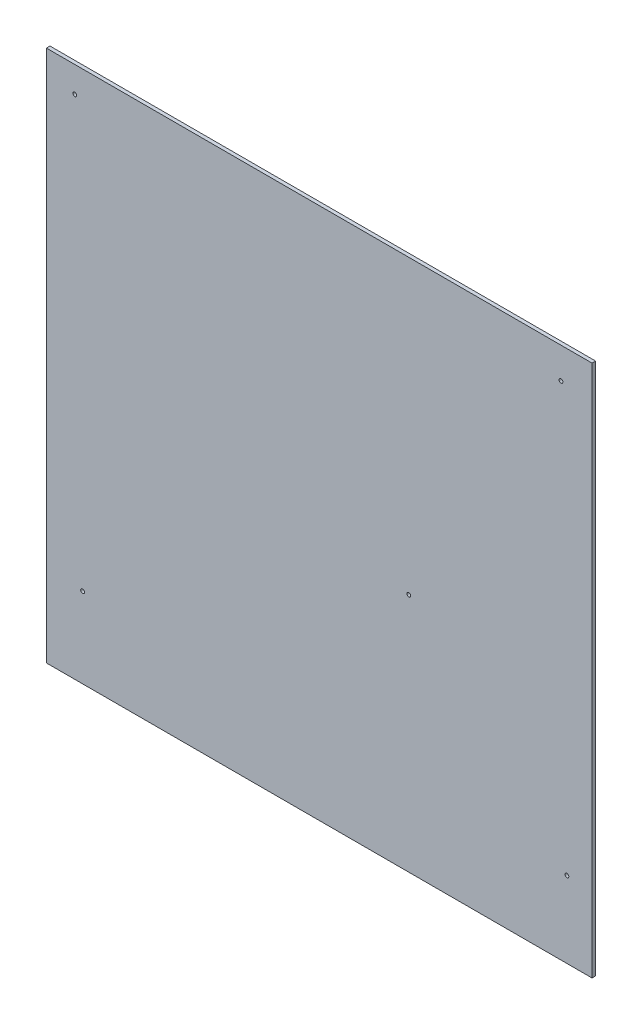
ISO-10303-21;
HEADER;
FILE_DESCRIPTION(('STEP AP214'),'2;1');
FILE_NAME('part.step','',(''),(''),'','','');
FILE_SCHEMA(('AUTOMOTIVE_DESIGN { 1 0 10303 214 1 1 1 1 }'));
ENDSEC;
DATA;
#1=APPLICATION_CONTEXT('core data for automotive mechanical design processes');
#2=APPLICATION_PROTOCOL_DEFINITION('international standard','automotive_design',2000,#1);
#3=PRODUCT_CONTEXT('',#1,'mechanical');
#4=PRODUCT('Part','Part','',(#3));
#5=PRODUCT_RELATED_PRODUCT_CATEGORY('part','',(#4));
#6=PRODUCT_DEFINITION_FORMATION('','',#4);
#7=PRODUCT_DEFINITION_CONTEXT('part definition',#1,'design');
#8=PRODUCT_DEFINITION('design','',#6,#7);
#9=PRODUCT_DEFINITION_SHAPE('','',#8);
#10=(LENGTH_UNIT() NAMED_UNIT(*) SI_UNIT(.MILLI.,.METRE.));
#11=(NAMED_UNIT(*) PLANE_ANGLE_UNIT() SI_UNIT($,.RADIAN.));
#12=(NAMED_UNIT(*) SI_UNIT($,.STERADIAN.) SOLID_ANGLE_UNIT());
#13=UNCERTAINTY_MEASURE_WITH_UNIT(LENGTH_MEASURE(1.E-05),#10,'distance_accuracy_value','');
#14=(GEOMETRIC_REPRESENTATION_CONTEXT(3) GLOBAL_UNCERTAINTY_ASSIGNED_CONTEXT((#13)) GLOBAL_UNIT_ASSIGNED_CONTEXT((#10,
#11,#12)) REPRESENTATION_CONTEXT('',''));
#15=CARTESIAN_POINT('',(0.,0.,0.));
#16=DIRECTION('',(0.,0.,1.));
#17=DIRECTION('',(1.,0.,0.));
#18=AXIS2_PLACEMENT_3D('',#15,#16,#17);
#19=CARTESIAN_POINT('',(0.,0.,3.));
#20=DIRECTION('',(0.,0.,1.));
#21=DIRECTION('',(1.,0.,0.));
#22=AXIS2_PLACEMENT_3D('',#19,#20,#21);
#23=PLANE('',#22);
#24=CARTESIAN_POINT('',(-440.703759338458,458.22247677224,3.));
#25=DIRECTION('',(0.,0.,1.));
#26=DIRECTION('',(1.,0.,0.));
#27=AXIS2_PLACEMENT_3D('',#24,#25,#26);
#28=CIRCLE('',#27,1.60000000000002);
#29=CARTESIAN_POINT('',(-439.103759338458,458.22247677224,3.));
#30=VERTEX_POINT('',#29);
#31=EDGE_CURVE('E126',#30,#30,#28,.T.);
#32=ORIENTED_EDGE('',*,*,#31,.F.);
#33=EDGE_LOOP('',(#32));
#34=FACE_BOUND('',#33,.T.);
#35=CARTESIAN_POINT('',(-27.6676299378187,96.9264277505402,3.));
#36=DIRECTION('',(0.,0.,1.));
#37=DIRECTION('',(1.,0.,0.));
#38=AXIS2_PLACEMENT_3D('',#35,#36,#37);
#39=CIRCLE('',#38,1.60000000000002);
#40=CARTESIAN_POINT('',(-26.0676299378187,96.9264277505402,3.));
#41=VERTEX_POINT('',#40);
#42=EDGE_CURVE('E114',#41,#41,#39,.T.);
#43=ORIENTED_EDGE('',*,*,#42,.F.);
#44=EDGE_LOOP('',(#43));
#45=FACE_BOUND('',#44,.T.);
#46=DIRECTION('',(0.,-1.,0.));
#47=VECTOR('',#46,1.);
#48=CARTESIAN_POINT('',(-464.552631863683,479.970647341209,3.));
#49=LINE('',#48,#47);
#50=CARTESIAN_POINT('',(-464.552631863683,479.970647341209,3.));
#51=VERTEX_POINT('',#50);
#52=CARTESIAN_POINT('',(-464.552631863683,32.9706473402095,3.));
#53=VERTEX_POINT('',#52);
#54=EDGE_CURVE('E84',#51,#53,#49,.T.);
#55=ORIENTED_EDGE('',*,*,#54,.T.);
#56=DIRECTION('',(1.,0.,0.));
#57=VECTOR('',#56,1.);
#58=CARTESIAN_POINT('',(-464.552631863683,32.9706473402095,3.));
#59=LINE('',#58,#57);
#60=CARTESIAN_POINT('',(-6.55263186291066,32.9706473402095,3.));
#61=VERTEX_POINT('',#60);
#62=EDGE_CURVE('E79',#53,#61,#59,.T.);
#63=ORIENTED_EDGE('',*,*,#62,.T.);
#64=DIRECTION('',(0.,1.,0.));
#65=VECTOR('',#64,1.);
#66=CARTESIAN_POINT('',(-6.55263186291066,479.970647341209,3.));
#67=LINE('',#66,#65);
#68=CARTESIAN_POINT('',(-6.55263186291066,479.970647341209,3.));
#69=VERTEX_POINT('',#68);
#70=EDGE_CURVE('E82',#61,#69,#67,.T.);
#71=ORIENTED_EDGE('',*,*,#70,.T.);
#72=DIRECTION('',(-1.,0.,0.));
#73=VECTOR('',#72,1.);
#74=CARTESIAN_POINT('',(-464.552631863683,479.970647341209,3.));
#75=LINE('',#74,#73);
#76=EDGE_CURVE('E49',#69,#51,#75,.T.);
#77=ORIENTED_EDGE('',*,*,#76,.T.);
#78=EDGE_LOOP('',(#55,#63,#71,#77));
#79=FACE_BOUND('',#78,.T.);
#80=CARTESIAN_POINT('',(-434.145413024924,100.3546542326,3.));
#81=DIRECTION('',(0.,0.,1.));
#82=DIRECTION('',(1.,0.,0.));
#83=AXIS2_PLACEMENT_3D('',#80,#81,#82);
#84=CIRCLE('',#83,1.60000000000002);
#85=CARTESIAN_POINT('',(-432.545413024924,100.3546542326,3.));
#86=VERTEX_POINT('',#85);
#87=EDGE_CURVE('E99',#86,#86,#84,.T.);
#88=ORIENTED_EDGE('',*,*,#87,.F.);
#89=EDGE_LOOP('',(#88));
#90=FACE_BOUND('',#89,.T.);
#91=CARTESIAN_POINT('',(-32.6407755290077,453.971767774607,3.));
#92=DIRECTION('',(0.,0.,1.));
#93=DIRECTION('',(1.,0.,0.));
#94=AXIS2_PLACEMENT_3D('',#91,#92,#93);
#95=CIRCLE('',#94,1.60000000000002);
#96=CARTESIAN_POINT('',(-31.0407755290077,453.971767774607,3.));
#97=VERTEX_POINT('',#96);
#98=EDGE_CURVE('E120',#97,#97,#95,.T.);
#99=ORIENTED_EDGE('',*,*,#98,.F.);
#100=EDGE_LOOP('',(#99));
#101=FACE_BOUND('',#100,.T.);
#102=CARTESIAN_POINT('',(-160.352631862911,234.620647340209,3.));
#103=DIRECTION('',(0.,0.,1.));
#104=DIRECTION('',(1.,0.,0.));
#105=AXIS2_PLACEMENT_3D('',#102,#103,#104);
#106=CIRCLE('',#105,1.59999999999997);
#107=CARTESIAN_POINT('',(-158.752631862911,234.620647340209,3.));
#108=VERTEX_POINT('',#107);
#109=EDGE_CURVE('E132',#108,#108,#106,.T.);
#110=ORIENTED_EDGE('',*,*,#109,.F.);
#111=EDGE_LOOP('',(#110));
#112=FACE_BOUND('',#111,.T.);
#113=ADVANCED_FACE('F32',(#34,#45,#79,#90,#101,#112),#23,.T.);
#114=CARTESIAN_POINT('',(0.,0.,0.));
#115=DIRECTION('',(0.,0.,1.));
#116=DIRECTION('',(1.,0.,0.));
#117=AXIS2_PLACEMENT_3D('',#114,#115,#116);
#118=PLANE('',#117);
#119=DIRECTION('',(0.,-1.,0.));
#120=VECTOR('',#119,1.);
#121=CARTESIAN_POINT('',(-464.552631863683,479.970647341209,0.));
#122=LINE('',#121,#120);
#123=CARTESIAN_POINT('',(-464.552631863683,479.970647341209,0.));
#124=VERTEX_POINT('',#123);
#125=CARTESIAN_POINT('',(-464.552631863683,32.9706473402095,0.));
#126=VERTEX_POINT('',#125);
#127=EDGE_CURVE('E96',#124,#126,#122,.T.);
#128=ORIENTED_EDGE('',*,*,#127,.F.);
#129=DIRECTION('',(-1.,0.,0.));
#130=VECTOR('',#129,1.);
#131=CARTESIAN_POINT('',(-464.552631863683,479.970647341209,0.));
#132=LINE('',#131,#130);
#133=CARTESIAN_POINT('',(-6.55263186291066,479.970647341209,0.));
#134=VERTEX_POINT('',#133);
#135=EDGE_CURVE('E72',#134,#124,#132,.T.);
#136=ORIENTED_EDGE('',*,*,#135,.F.);
#137=DIRECTION('',(0.,1.,0.));
#138=VECTOR('',#137,1.);
#139=CARTESIAN_POINT('',(-6.55263186291066,479.970647341209,0.));
#140=LINE('',#139,#138);
#141=CARTESIAN_POINT('',(-6.55263186291066,32.9706473402095,0.));
#142=VERTEX_POINT('',#141);
#143=EDGE_CURVE('E66',#142,#134,#140,.T.);
#144=ORIENTED_EDGE('',*,*,#143,.F.);
#145=DIRECTION('',(1.,0.,0.));
#146=VECTOR('',#145,1.);
#147=CARTESIAN_POINT('',(-464.552631863683,32.9706473402095,0.));
#148=LINE('',#147,#146);
#149=EDGE_CURVE('E88',#126,#142,#148,.T.);
#150=ORIENTED_EDGE('',*,*,#149,.F.);
#151=EDGE_LOOP('',(#128,#136,#144,#150));
#152=FACE_BOUND('',#151,.T.);
#153=CARTESIAN_POINT('',(-434.145413024924,100.3546542326,0.));
#154=DIRECTION('',(0.,0.,1.));
#155=DIRECTION('',(1.,0.,0.));
#156=AXIS2_PLACEMENT_3D('',#153,#154,#155);
#157=CIRCLE('',#156,1.60000000000002);
#158=CARTESIAN_POINT('',(-432.545413024924,100.3546542326,0.));
#159=VERTEX_POINT('',#158);
#160=EDGE_CURVE('E111',#159,#159,#157,.T.);
#161=ORIENTED_EDGE('',*,*,#160,.T.);
#162=EDGE_LOOP('',(#161));
#163=FACE_BOUND('',#162,.T.);
#164=CARTESIAN_POINT('',(-27.6676299378187,96.9264277505402,0.));
#165=DIRECTION('',(0.,0.,1.));
#166=DIRECTION('',(1.,0.,0.));
#167=AXIS2_PLACEMENT_3D('',#164,#165,#166);
#168=CIRCLE('',#167,1.60000000000002);
#169=CARTESIAN_POINT('',(-26.0676299378187,96.9264277505402,0.));
#170=VERTEX_POINT('',#169);
#171=EDGE_CURVE('E117',#170,#170,#168,.T.);
#172=ORIENTED_EDGE('',*,*,#171,.T.);
#173=EDGE_LOOP('',(#172));
#174=FACE_BOUND('',#173,.T.);
#175=CARTESIAN_POINT('',(-32.6407755290077,453.971767774607,0.));
#176=DIRECTION('',(0.,0.,1.));
#177=DIRECTION('',(1.,0.,0.));
#178=AXIS2_PLACEMENT_3D('',#175,#176,#177);
#179=CIRCLE('',#178,1.60000000000002);
#180=CARTESIAN_POINT('',(-31.0407755290077,453.971767774607,0.));
#181=VERTEX_POINT('',#180);
#182=EDGE_CURVE('E123',#181,#181,#179,.T.);
#183=ORIENTED_EDGE('',*,*,#182,.T.);
#184=EDGE_LOOP('',(#183));
#185=FACE_BOUND('',#184,.T.);
#186=CARTESIAN_POINT('',(-440.703759338458,458.22247677224,0.));
#187=DIRECTION('',(0.,0.,1.));
#188=DIRECTION('',(1.,0.,0.));
#189=AXIS2_PLACEMENT_3D('',#186,#187,#188);
#190=CIRCLE('',#189,1.60000000000002);
#191=CARTESIAN_POINT('',(-439.103759338458,458.22247677224,0.));
#192=VERTEX_POINT('',#191);
#193=EDGE_CURVE('E129',#192,#192,#190,.T.);
#194=ORIENTED_EDGE('',*,*,#193,.T.);
#195=EDGE_LOOP('',(#194));
#196=FACE_BOUND('',#195,.T.);
#197=CARTESIAN_POINT('',(-160.352631862911,234.620647340209,0.));
#198=DIRECTION('',(0.,0.,1.));
#199=DIRECTION('',(1.,0.,0.));
#200=AXIS2_PLACEMENT_3D('',#197,#198,#199);
#201=CIRCLE('',#200,1.59999999999997);
#202=CARTESIAN_POINT('',(-158.752631862911,234.620647340209,0.));
#203=VERTEX_POINT('',#202);
#204=EDGE_CURVE('E135',#203,#203,#201,.T.);
#205=ORIENTED_EDGE('',*,*,#204,.T.);
#206=EDGE_LOOP('',(#205));
#207=FACE_BOUND('',#206,.T.);
#208=ADVANCED_FACE('F107',(#152,#163,#174,#185,#196,#207),#118,.F.);
#209=CARTESIAN_POINT('',(-464.552631863683,479.970647341209,3.));
#210=DIRECTION('',(1.,0.,0.));
#211=DIRECTION('',(0.,0.,-1.));
#212=AXIS2_PLACEMENT_3D('',#209,#210,#211);
#213=PLANE('',#212);
#214=ORIENTED_EDGE('',*,*,#127,.T.);
#215=DIRECTION('',(0.,0.,-1.));
#216=VECTOR('',#215,1.);
#217=CARTESIAN_POINT('',(-464.552631863683,32.9706473402095,3.));
#218=LINE('',#217,#216);
#219=EDGE_CURVE('E11',#53,#126,#218,.T.);
#220=ORIENTED_EDGE('',*,*,#219,.F.);
#221=ORIENTED_EDGE('',*,*,#54,.F.);
#222=DIRECTION('',(0.,0.,-1.));
#223=VECTOR('',#222,1.);
#224=CARTESIAN_POINT('',(-464.552631863683,479.970647341209,3.));
#225=LINE('',#224,#223);
#226=EDGE_CURVE('E92',#51,#124,#225,.T.);
#227=ORIENTED_EDGE('',*,*,#226,.T.);
#228=EDGE_LOOP('',(#214,#220,#221,#227));
#229=FACE_BOUND('',#228,.T.);
#230=ADVANCED_FACE('F34',(#229),#213,.F.);
#231=CARTESIAN_POINT('',(-464.552631863683,32.9706473402095,3.));
#232=DIRECTION('',(0.,1.,0.));
#233=DIRECTION('',(0.,0.,1.));
#234=AXIS2_PLACEMENT_3D('',#231,#232,#233);
#235=PLANE('',#234);
#236=ORIENTED_EDGE('',*,*,#149,.T.);
#237=DIRECTION('',(0.,0.,-1.));
#238=VECTOR('',#237,1.);
#239=CARTESIAN_POINT('',(-6.55263186291066,32.9706473402095,3.));
#240=LINE('',#239,#238);
#241=EDGE_CURVE('E41',#61,#142,#240,.T.);
#242=ORIENTED_EDGE('',*,*,#241,.F.);
#243=ORIENTED_EDGE('',*,*,#62,.F.);
#244=ORIENTED_EDGE('',*,*,#219,.T.);
#245=EDGE_LOOP('',(#236,#242,#243,#244));
#246=FACE_BOUND('',#245,.T.);
#247=ADVANCED_FACE('F87',(#246),#235,.F.);
#248=CARTESIAN_POINT('',(-6.55263186291066,479.970647341209,3.));
#249=DIRECTION('',(-1.,0.,0.));
#250=DIRECTION('',(0.,0.,1.));
#251=AXIS2_PLACEMENT_3D('',#248,#249,#250);
#252=PLANE('',#251);
#253=ORIENTED_EDGE('',*,*,#143,.T.);
#254=DIRECTION('',(0.,0.,-1.));
#255=VECTOR('',#254,1.);
#256=CARTESIAN_POINT('',(-6.55263186291066,479.970647341209,3.));
#257=LINE('',#256,#255);
#258=EDGE_CURVE('E89',#69,#134,#257,.T.);
#259=ORIENTED_EDGE('',*,*,#258,.F.);
#260=ORIENTED_EDGE('',*,*,#70,.F.);
#261=ORIENTED_EDGE('',*,*,#241,.T.);
#262=EDGE_LOOP('',(#253,#259,#260,#261));
#263=FACE_BOUND('',#262,.T.);
#264=ADVANCED_FACE('F90',(#263),#252,.F.);
#265=CARTESIAN_POINT('',(-464.552631863683,479.970647341209,3.));
#266=DIRECTION('',(0.,-1.,0.));
#267=DIRECTION('',(0.,0.,-1.));
#268=AXIS2_PLACEMENT_3D('',#265,#266,#267);
#269=PLANE('',#268);
#270=ORIENTED_EDGE('',*,*,#135,.T.);
#271=ORIENTED_EDGE('',*,*,#226,.F.);
#272=ORIENTED_EDGE('',*,*,#76,.F.);
#273=ORIENTED_EDGE('',*,*,#258,.T.);
#274=EDGE_LOOP('',(#270,#271,#272,#273));
#275=FACE_BOUND('',#274,.T.);
#276=ADVANCED_FACE('F104',(#275),#269,.F.);
#277=CARTESIAN_POINT('',(-434.145413024924,100.3546542326,3.));
#278=DIRECTION('',(0.,0.,-1.));
#279=DIRECTION('',(-1.,0.,0.));
#280=AXIS2_PLACEMENT_3D('',#277,#278,#279);
#281=CYLINDRICAL_SURFACE('',#280,1.60000000000002);
#282=ORIENTED_EDGE('',*,*,#87,.T.);
#283=EDGE_LOOP('',(#282));
#284=FACE_BOUND('',#283,.T.);
#285=ORIENTED_EDGE('',*,*,#160,.F.);
#286=EDGE_LOOP('',(#285));
#287=FACE_BOUND('',#286,.T.);
#288=ADVANCED_FACE('F154',(#284,#287),#281,.F.);
#289=CARTESIAN_POINT('',(-27.6676299378187,96.9264277505402,3.));
#290=DIRECTION('',(0.,0.,-1.));
#291=DIRECTION('',(-1.,0.,0.));
#292=AXIS2_PLACEMENT_3D('',#289,#290,#291);
#293=CYLINDRICAL_SURFACE('',#292,1.60000000000002);
#294=ORIENTED_EDGE('',*,*,#42,.T.);
#295=EDGE_LOOP('',(#294));
#296=FACE_BOUND('',#295,.T.);
#297=ORIENTED_EDGE('',*,*,#171,.F.);
#298=EDGE_LOOP('',(#297));
#299=FACE_BOUND('',#298,.T.);
#300=ADVANCED_FACE('F199',(#296,#299),#293,.F.);
#301=CARTESIAN_POINT('',(-32.6407755290077,453.971767774607,3.));
#302=DIRECTION('',(0.,0.,-1.));
#303=DIRECTION('',(-1.,0.,0.));
#304=AXIS2_PLACEMENT_3D('',#301,#302,#303);
#305=CYLINDRICAL_SURFACE('',#304,1.60000000000002);
#306=ORIENTED_EDGE('',*,*,#98,.T.);
#307=EDGE_LOOP('',(#306));
#308=FACE_BOUND('',#307,.T.);
#309=ORIENTED_EDGE('',*,*,#182,.F.);
#310=EDGE_LOOP('',(#309));
#311=FACE_BOUND('',#310,.T.);
#312=ADVANCED_FACE('F207',(#308,#311),#305,.F.);
#313=CARTESIAN_POINT('',(-440.703759338458,458.22247677224,3.));
#314=DIRECTION('',(0.,0.,-1.));
#315=DIRECTION('',(-1.,0.,0.));
#316=AXIS2_PLACEMENT_3D('',#313,#314,#315);
#317=CYLINDRICAL_SURFACE('',#316,1.60000000000002);
#318=ORIENTED_EDGE('',*,*,#31,.T.);
#319=EDGE_LOOP('',(#318));
#320=FACE_BOUND('',#319,.T.);
#321=ORIENTED_EDGE('',*,*,#193,.F.);
#322=EDGE_LOOP('',(#321));
#323=FACE_BOUND('',#322,.T.);
#324=ADVANCED_FACE('F215',(#320,#323),#317,.F.);
#325=CARTESIAN_POINT('',(-160.352631862911,234.620647340209,3.));
#326=DIRECTION('',(0.,0.,-1.));
#327=DIRECTION('',(-1.,0.,0.));
#328=AXIS2_PLACEMENT_3D('',#325,#326,#327);
#329=CYLINDRICAL_SURFACE('',#328,1.59999999999997);
#330=ORIENTED_EDGE('',*,*,#109,.T.);
#331=EDGE_LOOP('',(#330));
#332=FACE_BOUND('',#331,.T.);
#333=ORIENTED_EDGE('',*,*,#204,.F.);
#334=EDGE_LOOP('',(#333));
#335=FACE_BOUND('',#334,.T.);
#336=ADVANCED_FACE('F141',(#332,#335),#329,.F.);
#337=CLOSED_SHELL('',(#113,#208,#230,#247,#264,#276,#288,#300,#312,#324,#336));
#338=MANIFOLD_SOLID_BREP('B2',#337);
#339=ADVANCED_BREP_SHAPE_REPRESENTATION('',(#18,#338),#14);
#340=SHAPE_DEFINITION_REPRESENTATION(#9,#339);
ENDSEC;
END-ISO-10303-21;
